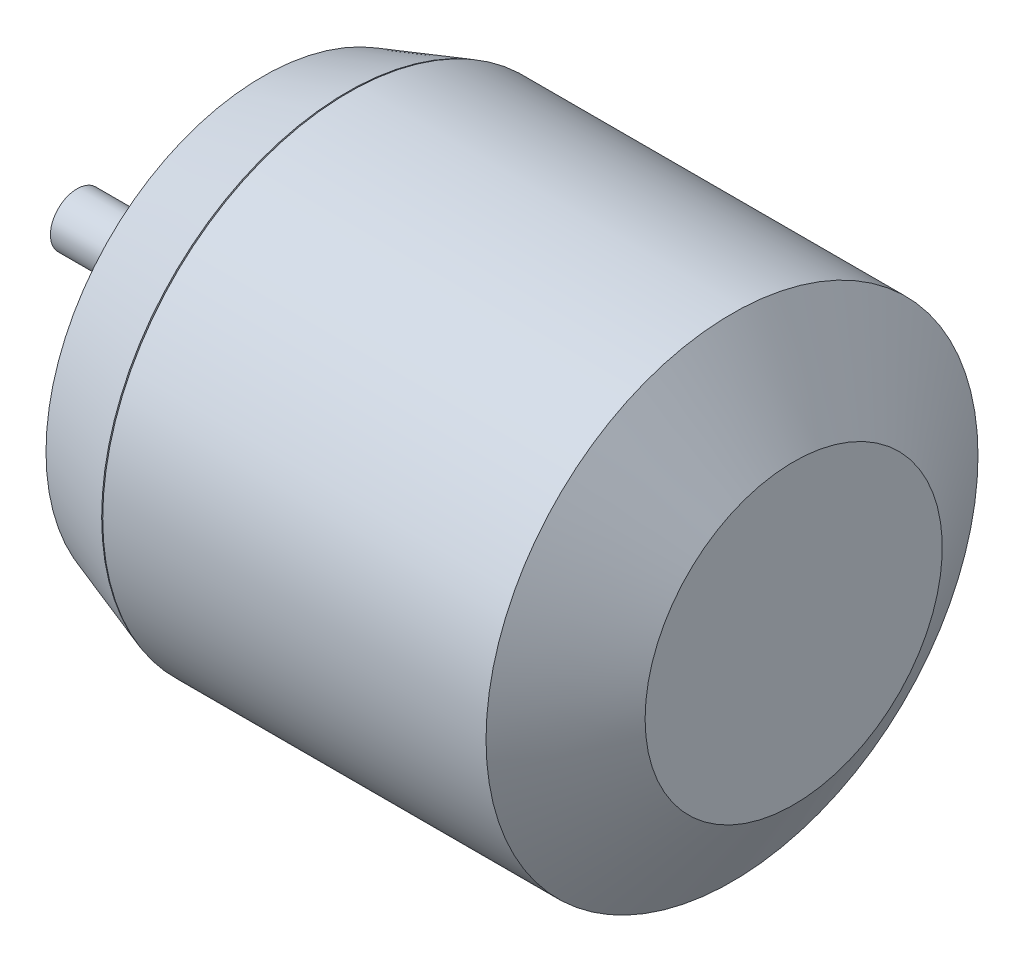
ISO-10303-21;
HEADER;
FILE_DESCRIPTION(('STEP AP214'),'2;1');
FILE_NAME('part.step','',(''),(''),'','','');
FILE_SCHEMA(('AUTOMOTIVE_DESIGN { 1 0 10303 214 1 1 1 1 }'));
ENDSEC;
DATA;
#1=APPLICATION_CONTEXT('core data for automotive mechanical design processes');
#2=APPLICATION_PROTOCOL_DEFINITION('international standard','automotive_design',2000,#1);
#3=PRODUCT_CONTEXT('',#1,'mechanical');
#4=PRODUCT('Part','Part','',(#3));
#5=PRODUCT_RELATED_PRODUCT_CATEGORY('part','',(#4));
#6=PRODUCT_DEFINITION_FORMATION('','',#4);
#7=PRODUCT_DEFINITION_CONTEXT('part definition',#1,'design');
#8=PRODUCT_DEFINITION('design','',#6,#7);
#9=PRODUCT_DEFINITION_SHAPE('','',#8);
#10=(LENGTH_UNIT() NAMED_UNIT(*) SI_UNIT(.MILLI.,.METRE.));
#11=(NAMED_UNIT(*) PLANE_ANGLE_UNIT() SI_UNIT($,.RADIAN.));
#12=(NAMED_UNIT(*) SI_UNIT($,.STERADIAN.) SOLID_ANGLE_UNIT());
#13=UNCERTAINTY_MEASURE_WITH_UNIT(LENGTH_MEASURE(1.E-05),#10,'distance_accuracy_value','');
#14=(GEOMETRIC_REPRESENTATION_CONTEXT(3) GLOBAL_UNCERTAINTY_ASSIGNED_CONTEXT((#13)) GLOBAL_UNIT_ASSIGNED_CONTEXT((#10,
#11,#12)) REPRESENTATION_CONTEXT('',''));
#15=CARTESIAN_POINT('',(0.,0.,0.));
#16=DIRECTION('',(0.,0.,1.));
#17=DIRECTION('',(1.,0.,0.));
#18=AXIS2_PLACEMENT_3D('',#15,#16,#17);
#19=CARTESIAN_POINT('',(-25.1452057720306,0.,0.));
#20=DIRECTION('',(1.,0.,0.));
#21=DIRECTION('',(0.,0.,-1.));
#22=AXIS2_PLACEMENT_3D('',#19,#20,#21);
#23=CONICAL_SURFACE('',#22,6.9,0.429327057848925);
#24=CARTESIAN_POINT('',(-25.1452057720306,0.,0.));
#25=DIRECTION('',(-1.,0.,0.));
#26=DIRECTION('',(0.,0.,1.));
#27=AXIS2_PLACEMENT_3D('',#24,#25,#26);
#28=CIRCLE('',#27,6.9);
#29=CARTESIAN_POINT('',(-25.1452057720306,-3.51905299043924,5.93517194784453));
#30=VERTEX_POINT('',#29);
#31=CARTESIAN_POINT('',(-25.1452057720306,4.99725638669145,-4.75788068426179));
#32=VERTEX_POINT('',#31);
#33=EDGE_CURVE('E97',#30,#32,#28,.T.);
#34=ORIENTED_EDGE('',*,*,#33,.T.);
#35=CARTESIAN_POINT('',(-25.145005772029,4.99738174548814,-4.75788180233565));
#36=CARTESIAN_POINT('',(-25.1603238235413,4.98778474300103,-4.75779287370484));
#37=CARTESIAN_POINT('',(-25.1755932331706,4.9781127907812,-4.75779975591919));
#38=CARTESIAN_POINT('',(-25.2060347689655,4.95861898668227,-4.75800514204022));
#39=CARTESIAN_POINT('',(-25.2212068951293,4.9487971348002,-4.75820364595073));
#40=CARTESIAN_POINT('',(-25.2363303794081,4.93890033318242,-4.75849796071019));
#41=B_SPLINE_CURVE_WITH_KNOTS('',3,(#35,#36,#37,#38,#39,#40),.UNSPECIFIED.,.F.,.F.,(4,2,4),(0.,
0.0542246641095933,0.108449329297418),.UNSPECIFIED.);
#42=CARTESIAN_POINT('',(-25.2361303794081,4.93903126070327,-4.75849403327332));
#43=VERTEX_POINT('',#42);
#44=EDGE_CURVE('E173',#32,#43,#41,.T.);
#45=ORIENTED_EDGE('',*,*,#44,.T.);
#46=CARTESIAN_POINT('',(-25.2361303794081,0.,0.));
#47=DIRECTION('',(-1.,0.,0.));
#48=DIRECTION('',(0.,0.,1.));
#49=AXIS2_PLACEMENT_3D('',#46,#47,#48);
#50=CIRCLE('',#49,6.85837409732817);
#51=CARTESIAN_POINT('',(-25.2361303794081,-3.53267926166389,5.87856040992281));
#52=VERTEX_POINT('',#51);
#53=EDGE_CURVE('E98',#52,#43,#50,.T.);
#54=ORIENTED_EDGE('',*,*,#53,.F.);
#55=CARTESIAN_POINT('',(-25.9610430816436,-3.86458885541579,5.25929741176484));
#56=CARTESIAN_POINT('',(-25.9477252974255,-3.84502247947316,5.28123920977013));
#57=CARTESIAN_POINT('',(-25.9325982722109,-3.82671214210631,5.3030539444413));
#58=CARTESIAN_POINT('',(-25.8995326379729,-3.79243431141013,5.34619155358342));
#59=CARTESIAN_POINT('',(-25.8816071462209,-3.77645652880026,5.36751621553208));
#60=CARTESIAN_POINT('',(-25.825158695959,-3.73194652846786,5.43010394495082));
#61=CARTESIAN_POINT('',(-25.7835468642932,-3.70630194832748,5.4706057619467));
#62=CARTESIAN_POINT('',(-25.7022958103188,-3.66450192424559,5.54329334026213));
#63=CARTESIAN_POINT('',(-25.6633429796953,-3.64749285801017,5.57579796245902));
#64=CARTESIAN_POINT('',(-25.5830335119541,-3.61689082679079,5.63942387452686));
#65=CARTESIAN_POINT('',(-25.5416759933171,-3.60329912440231,5.6705446496298));
#66=CARTESIAN_POINT('',(-25.4146016102886,-3.56654491373128,5.76245551290415));
#67=CARTESIAN_POINT('',(-25.3263354821256,-3.54761038193469,5.82141035858996));
#68=CARTESIAN_POINT('',(-25.2060807074198,-3.52770534208598,5.89759855881237));
#69=CARTESIAN_POINT('',(-25.1756346088298,-3.52315424686136,5.91654526061992));
#70=CARTESIAN_POINT('',(-25.1412778810979,-3.51852357710136,5.93757636714795));
#71=CARTESIAN_POINT('',(-25.1375472831263,-3.51802738878405,5.93985542908198));
#72=CARTESIAN_POINT('',(-25.1338140027945,-3.51753740525783,5.94213160117815));
#73=B_SPLINE_CURVE_WITH_KNOTS('',3,(#55,#56,#57,#58,#59,#60,#61,#62,#63,#64,#65,#66,#67,#68,#69,
#70,#71,#72),.UNSPECIFIED.,.F.,.F.,(4,2,2,2,2,2,2,2,4),(0.,0.0965983438161288,0.192756791854487,
0.382355240273739,0.542697768388109,0.703099450648593,1.02577192879648,1.13421840937265,
1.14741762598275),.UNSPECIFIED.);
#74=EDGE_CURVE('E52',#52,#30,#73,.T.);
#75=ORIENTED_EDGE('',*,*,#74,.T.);
#76=EDGE_LOOP('',(#34,#45,#54,#75));
#77=FACE_BOUND('',#76,.T.);
#78=ADVANCED_FACE('F37',(#77),#23,.T.);
#79=CARTESIAN_POINT('',(-40.5,0.,0.));
#80=DIRECTION('',(1.,0.,0.));
#81=DIRECTION('',(0.,0.,-1.));
#82=AXIS2_PLACEMENT_3D('',#79,#80,#81);
#83=PLANE('',#82);
#84=CARTESIAN_POINT('',(-40.5,0.,0.));
#85=DIRECTION('',(-1.,0.,0.));
#86=DIRECTION('',(0.,0.,1.));
#87=AXIS2_PLACEMENT_3D('',#84,#85,#86);
#88=CIRCLE('',#87,1.5);
#89=CARTESIAN_POINT('',(-40.5,0.,1.5));
#90=VERTEX_POINT('',#89);
#91=EDGE_CURVE('E272',#90,#90,#88,.T.);
#92=ORIENTED_EDGE('',*,*,#91,.T.);
#93=EDGE_LOOP('',(#92));
#94=FACE_BOUND('',#93,.T.);
#95=ADVANCED_FACE('F39',(#94),#83,.F.);
#96=CARTESIAN_POINT('',(0.,0.,0.));
#97=DIRECTION('',(1.,0.,0.));
#98=DIRECTION('',(0.,0.,-1.));
#99=AXIS2_PLACEMENT_3D('',#96,#97,#98);
#100=PLANE('',#99);
#101=CARTESIAN_POINT('',(0.,0.,0.));
#102=DIRECTION('',(-1.,0.,0.));
#103=DIRECTION('',(0.,0.,1.));
#104=AXIS2_PLACEMENT_3D('',#101,#102,#103);
#105=CIRCLE('',#104,8.3963945868005);
#106=CARTESIAN_POINT('',(0.,0.,8.3963945868005));
#107=VERTEX_POINT('',#106);
#108=EDGE_CURVE('E11',#107,#107,#105,.T.);
#109=ORIENTED_EDGE('',*,*,#108,.F.);
#110=EDGE_LOOP('',(#109));
#111=FACE_BOUND('',#110,.T.);
#112=ADVANCED_FACE('F116',(#111),#100,.T.);
#113=CARTESIAN_POINT('',(-3.48502507617356,0.,0.));
#114=DIRECTION('',(-1.,0.,0.));
#115=DIRECTION('',(0.,0.,1.));
#116=AXIS2_PLACEMENT_3D('',#113,#114,#115);
#117=CONICAL_SURFACE('',#116,13.9,1.00630366789389);
#118=ORIENTED_EDGE('',*,*,#108,.T.);
#119=EDGE_LOOP('',(#118));
#120=FACE_BOUND('',#119,.T.);
#121=CARTESIAN_POINT('',(-3.48502507617356,0.,0.));
#122=DIRECTION('',(-1.,0.,0.));
#123=DIRECTION('',(0.,0.,1.));
#124=AXIS2_PLACEMENT_3D('',#121,#122,#123);
#125=CIRCLE('',#124,13.9);
#126=CARTESIAN_POINT('',(-3.48502507617356,0.,13.9));
#127=VERTEX_POINT('',#126);
#128=EDGE_CURVE('E45',#127,#127,#125,.T.);
#129=ORIENTED_EDGE('',*,*,#128,.F.);
#130=EDGE_LOOP('',(#129));
#131=FACE_BOUND('',#130,.T.);
#132=ADVANCED_FACE('F114',(#120,#131),#117,.T.);
#133=CARTESIAN_POINT('',(-72.5044744062834,0.,0.));
#134=DIRECTION('',(-1.,0.,0.));
#135=DIRECTION('',(0.,0.,1.));
#136=AXIS2_PLACEMENT_3D('',#133,#134,#135);
#137=CYLINDRICAL_SURFACE('',#136,13.9);
#138=ORIENTED_EDGE('',*,*,#128,.T.);
#139=EDGE_LOOP('',(#138));
#140=FACE_BOUND('',#139,.T.);
#141=CARTESIAN_POINT('',(-25.1452057720306,0.,0.));
#142=DIRECTION('',(-1.,0.,0.));
#143=DIRECTION('',(0.,0.,1.));
#144=AXIS2_PLACEMENT_3D('',#141,#142,#143);
#145=CIRCLE('',#144,13.9);
#146=CARTESIAN_POINT('',(-25.1452057720306,0.,13.9));
#147=VERTEX_POINT('',#146);
#148=EDGE_CURVE('E106',#147,#147,#145,.T.);
#149=ORIENTED_EDGE('',*,*,#148,.F.);
#150=EDGE_LOOP('',(#149));
#151=FACE_BOUND('',#150,.T.);
#152=ADVANCED_FACE('F111',(#140,#151),#137,.T.);
#153=CARTESIAN_POINT('',(-25.1452057720306,0.,0.));
#154=DIRECTION('',(1.,0.,0.));
#155=DIRECTION('',(0.,0.,-1.));
#156=AXIS2_PLACEMENT_3D('',#153,#154,#155);
#157=PLANE('',#156);
#158=CARTESIAN_POINT('',(-25.1452057720306,-7.43116313131021,-5.91843007189033));
#159=DIRECTION('',(1.,0.,0.));
#160=DIRECTION('',(0.,0.,-1.));
#161=AXIS2_PLACEMENT_3D('',#158,#159,#160);
#162=CIRCLE('',#161,1.5);
#163=CARTESIAN_POINT('',(-25.1452057720306,-7.43116313131021,-7.41843007189033));
#164=VERTEX_POINT('',#163);
#165=EDGE_CURVE('E84',#164,#164,#162,.T.);
#166=ORIENTED_EDGE('',*,*,#165,.T.);
#167=EDGE_LOOP('',(#166));
#168=FACE_BOUND('',#167,.T.);
#169=CARTESIAN_POINT('',(-25.1452057720306,7.43116313131017,5.91843007189039));
#170=DIRECTION('',(1.,0.,0.));
#171=DIRECTION('',(0.,0.,-1.));
#172=AXIS2_PLACEMENT_3D('',#169,#170,#171);
#173=CIRCLE('',#172,1.5);
#174=CARTESIAN_POINT('',(-25.1452057720306,7.43116313131017,4.41843007189039));
#175=VERTEX_POINT('',#174);
#176=EDGE_CURVE('E152',#175,#175,#173,.T.);
#177=ORIENTED_EDGE('',*,*,#176,.T.);
#178=EDGE_LOOP('',(#177));
#179=FACE_BOUND('',#178,.T.);
#180=CARTESIAN_POINT('',(-25.1452057720306,3.5190529904392,-5.93517194784456));
#181=VERTEX_POINT('',#180);
#182=CARTESIAN_POINT('',(-25.1452057720306,-4.99725638669149,4.75788068426176));
#183=VERTEX_POINT('',#182);
#184=EDGE_CURVE('E92',#181,#183,#28,.T.);
#185=ORIENTED_EDGE('',*,*,#184,.F.);
#186=CARTESIAN_POINT('',(-25.1452057720306,4.98394111317083,-6.25782158426121));
#187=DIRECTION('',(1.,0.,0.));
#188=DIRECTION('',(0.,0.,-1.));
#189=AXIS2_PLACEMENT_3D('',#186,#187,#188);
#190=CIRCLE('',#189,1.5);
#191=EDGE_CURVE('E157',#181,#32,#190,.T.);
#192=ORIENTED_EDGE('',*,*,#191,.T.);
#193=ORIENTED_EDGE('',*,*,#33,.F.);
#194=CARTESIAN_POINT('',(-25.1452057720306,-4.98394111317088,6.25782158426118));
#195=DIRECTION('',(1.,0.,0.));
#196=DIRECTION('',(0.,0.,-1.));
#197=AXIS2_PLACEMENT_3D('',#194,#195,#196);
#198=CIRCLE('',#197,1.5);
#199=EDGE_CURVE('E93',#30,#183,#198,.T.);
#200=ORIENTED_EDGE('',*,*,#199,.T.);
#201=EDGE_LOOP('',(#185,#192,#193,#200));
#202=FACE_BOUND('',#201,.T.);
#203=ORIENTED_EDGE('',*,*,#148,.T.);
#204=EDGE_LOOP('',(#203));
#205=FACE_BOUND('',#204,.T.);
#206=ADVANCED_FACE('F123',(#168,#179,#202,#205),#157,.F.);
#207=CARTESIAN_POINT('',(-25.2361303794081,3.53267926166385,-5.87856040992283));
#208=VERTEX_POINT('',#207);
#209=CARTESIAN_POINT('',(-25.2361303794081,-4.9390312607033,4.75849403327329));
#210=VERTEX_POINT('',#209);
#211=EDGE_CURVE('E90',#208,#210,#50,.T.);
#212=ORIENTED_EDGE('',*,*,#211,.F.);
#213=CARTESIAN_POINT('',(-25.9610430816436,3.86458885541574,-5.25929741176488));
#214=CARTESIAN_POINT('',(-25.9477252974255,3.84502247947312,-5.28123920977017));
#215=CARTESIAN_POINT('',(-25.9325982722109,3.82671214210627,-5.30305394444133));
#216=CARTESIAN_POINT('',(-25.8995326379729,3.79243431141008,-5.34619155358345));
#217=CARTESIAN_POINT('',(-25.8816071462209,3.77645652880021,-5.36751621553212));
#218=CARTESIAN_POINT('',(-25.825158695959,3.73194652846782,-5.43010394495085));
#219=CARTESIAN_POINT('',(-25.7835468642932,3.70630194832743,-5.47060576194674));
#220=CARTESIAN_POINT('',(-25.7022958103188,3.66450192424555,-5.54329334026216));
#221=CARTESIAN_POINT('',(-25.6633429796953,3.64749285801012,-5.57579796245905));
#222=CARTESIAN_POINT('',(-25.5830335119541,3.61689082679075,-5.63942387452688));
#223=CARTESIAN_POINT('',(-25.5416759933171,3.60329912440227,-5.67054464962983));
#224=CARTESIAN_POINT('',(-25.4146016102886,3.56654491373124,-5.76245551290417));
#225=CARTESIAN_POINT('',(-25.3263354821256,3.54761038193465,-5.82141035858997));
#226=CARTESIAN_POINT('',(-25.2060807074203,3.52770534208602,-5.89759855881206));
#227=CARTESIAN_POINT('',(-25.1756346088309,3.52315424686147,-5.91654526061929));
#228=CARTESIAN_POINT('',(-25.141277881099,3.51852357710146,-5.93757636714734));
#229=CARTESIAN_POINT('',(-25.1375472831268,3.51802738878407,-5.93985542908169));
#230=CARTESIAN_POINT('',(-25.1338140027945,3.51753740525779,-5.94213160117818));
#231=B_SPLINE_CURVE_WITH_KNOTS('',3,(#213,#214,#215,#216,#217,#218,#219,#220,#221,#222,#223,
#224,#225,#226,#227,#228,#229,#230),.UNSPECIFIED.,.F.,.F.,(4,2,2,2,2,2,2,2,4),(0.,
0.0965983438161255,0.192756791854486,0.382355240273738,0.5426977683881,0.703099450648571,
1.02577192879644,1.1342184093708,1.14741762598275),.UNSPECIFIED.);
#232=EDGE_CURVE('E60',#208,#181,#231,.T.);
#233=ORIENTED_EDGE('',*,*,#232,.T.);
#234=ORIENTED_EDGE('',*,*,#184,.T.);
#235=CARTESIAN_POINT('',(-25.1450057720306,-4.9973817454872,4.7578818023356));
#236=CARTESIAN_POINT('',(-25.1603238235426,-4.98778474300025,4.7577928737048));
#237=CARTESIAN_POINT('',(-25.1755932331716,-4.97811279078057,4.75779975591915));
#238=CARTESIAN_POINT('',(-25.2060347689661,-4.95861898668197,4.7580051420402));
#239=CARTESIAN_POINT('',(-25.2212068951296,-4.94879713480005,4.7582036459507));
#240=CARTESIAN_POINT('',(-25.2363303794081,-4.93890033318244,4.75849796071016));
#241=B_SPLINE_CURVE_WITH_KNOTS('',3,(#235,#236,#237,#238,#239,#240),.UNSPECIFIED.,.F.,.F.,(4,2,
4),(0.,0.0542246641086849,0.108449329295604),.UNSPECIFIED.);
#242=EDGE_CURVE('E78',#183,#210,#241,.T.);
#243=ORIENTED_EDGE('',*,*,#242,.T.);
#244=EDGE_LOOP('',(#212,#233,#234,#243));
#245=FACE_BOUND('',#244,.T.);
#246=ADVANCED_FACE('F89',(#245),#23,.T.);
#247=CARTESIAN_POINT('',(-25.2361303794081,0.,0.));
#248=DIRECTION('',(-1.,0.,0.));
#249=DIRECTION('',(0.,0.,1.));
#250=AXIS2_PLACEMENT_3D('',#247,#248,#249);
#251=PLANE('',#250);
#252=CARTESIAN_POINT('',(-25.2361303794081,-7.43116313131021,-5.91843007189033));
#253=DIRECTION('',(-1.,0.,0.));
#254=DIRECTION('',(0.,0.,1.));
#255=AXIS2_PLACEMENT_3D('',#252,#253,#254);
#256=CIRCLE('',#255,1.5);
#257=CARTESIAN_POINT('',(-25.2361303794081,-7.43116313131021,-4.41843007189033));
#258=VERTEX_POINT('',#257);
#259=EDGE_CURVE('E205',#258,#258,#256,.T.);
#260=ORIENTED_EDGE('',*,*,#259,.T.);
#261=EDGE_LOOP('',(#260));
#262=FACE_BOUND('',#261,.T.);
#263=CARTESIAN_POINT('',(-25.2361303794081,7.43116313131017,5.91843007189039));
#264=DIRECTION('',(-1.,0.,0.));
#265=DIRECTION('',(0.,0.,1.));
#266=AXIS2_PLACEMENT_3D('',#263,#264,#265);
#267=CIRCLE('',#266,1.5);
#268=CARTESIAN_POINT('',(-25.2361303794081,7.43116313131017,7.41843007189039));
#269=VERTEX_POINT('',#268);
#270=EDGE_CURVE('E209',#269,#269,#267,.T.);
#271=ORIENTED_EDGE('',*,*,#270,.T.);
#272=EDGE_LOOP('',(#271));
#273=FACE_BOUND('',#272,.T.);
#274=CARTESIAN_POINT('',(-25.2361303794081,0.,0.));
#275=DIRECTION('',(-1.,0.,0.));
#276=DIRECTION('',(0.,0.,1.));
#277=AXIS2_PLACEMENT_3D('',#274,#275,#276);
#278=CIRCLE('',#277,13.869097433356);
#279=CARTESIAN_POINT('',(-25.2361303794081,0.,13.869097433356));
#280=VERTEX_POINT('',#279);
#281=EDGE_CURVE('E102',#280,#280,#278,.T.);
#282=ORIENTED_EDGE('',*,*,#281,.F.);
#283=EDGE_LOOP('',(#282));
#284=FACE_BOUND('',#283,.T.);
#285=ORIENTED_EDGE('',*,*,#53,.T.);
#286=CARTESIAN_POINT('',(-25.2361303794081,4.98394111317083,-6.25782158426121));
#287=DIRECTION('',(-1.,0.,0.));
#288=DIRECTION('',(0.,0.,1.));
#289=AXIS2_PLACEMENT_3D('',#286,#287,#288);
#290=CIRCLE('',#289,1.5);
#291=EDGE_CURVE('E96',#43,#208,#290,.T.);
#292=ORIENTED_EDGE('',*,*,#291,.T.);
#293=ORIENTED_EDGE('',*,*,#211,.T.);
#294=CARTESIAN_POINT('',(-25.2361303794081,-4.98394111317088,6.25782158426118));
#295=DIRECTION('',(-1.,0.,0.));
#296=DIRECTION('',(0.,0.,1.));
#297=AXIS2_PLACEMENT_3D('',#294,#295,#296);
#298=CIRCLE('',#297,1.5);
#299=EDGE_CURVE('E75',#210,#52,#298,.T.);
#300=ORIENTED_EDGE('',*,*,#299,.T.);
#301=EDGE_LOOP('',(#285,#292,#293,#300));
#302=FACE_BOUND('',#301,.T.);
#303=ADVANCED_FACE('F95',(#262,#273,#284,#302),#251,.F.);
#304=CARTESIAN_POINT('',(-30.,0.,0.));
#305=DIRECTION('',(1.,0.,0.));
#306=DIRECTION('',(0.,0.,-1.));
#307=AXIS2_PLACEMENT_3D('',#304,#305,#306);
#308=CONICAL_SURFACE('',#307,12.25,0.327622173426619);
#309=ORIENTED_EDGE('',*,*,#281,.T.);
#310=EDGE_LOOP('',(#309));
#311=FACE_BOUND('',#310,.T.);
#312=CARTESIAN_POINT('',(-30.,0.,0.));
#313=DIRECTION('',(-1.,0.,0.));
#314=DIRECTION('',(0.,0.,1.));
#315=AXIS2_PLACEMENT_3D('',#312,#313,#314);
#316=CIRCLE('',#315,12.25);
#317=CARTESIAN_POINT('',(-30.,0.,12.25));
#318=VERTEX_POINT('',#317);
#319=EDGE_CURVE('E266',#318,#318,#316,.T.);
#320=ORIENTED_EDGE('',*,*,#319,.F.);
#321=EDGE_LOOP('',(#320));
#322=FACE_BOUND('',#321,.T.);
#323=ADVANCED_FACE('F141',(#311,#322),#308,.T.);
#324=CARTESIAN_POINT('',(-30.,0.,0.));
#325=DIRECTION('',(1.,0.,0.));
#326=DIRECTION('',(0.,0.,-1.));
#327=AXIS2_PLACEMENT_3D('',#324,#325,#326);
#328=PLANE('',#327);
#329=CARTESIAN_POINT('',(-30.,4.98394111317083,-6.25782158426121));
#330=DIRECTION('',(-1.,0.,0.));
#331=DIRECTION('',(0.,0.,1.));
#332=AXIS2_PLACEMENT_3D('',#329,#330,#331);
#333=CIRCLE('',#332,1.5);
#334=CARTESIAN_POINT('',(-30.,4.98394111317083,-4.75782158426121));
#335=VERTEX_POINT('',#334);
#336=EDGE_CURVE('E226',#335,#335,#333,.T.);
#337=ORIENTED_EDGE('',*,*,#336,.F.);
#338=EDGE_LOOP('',(#337));
#339=FACE_BOUND('',#338,.T.);
#340=CARTESIAN_POINT('',(-30.,-4.98394111317088,6.25782158426118));
#341=DIRECTION('',(-1.,0.,0.));
#342=DIRECTION('',(0.,0.,-1.));
#343=AXIS2_PLACEMENT_3D('',#340,#341,#342);
#344=CIRCLE('',#343,1.5);
#345=CARTESIAN_POINT('',(-30.,-4.98394111317088,4.75782158426118));
#346=VERTEX_POINT('',#345);
#347=EDGE_CURVE('E219',#346,#346,#344,.T.);
#348=ORIENTED_EDGE('',*,*,#347,.F.);
#349=EDGE_LOOP('',(#348));
#350=FACE_BOUND('',#349,.T.);
#351=CARTESIAN_POINT('',(-30.,-7.43116313131021,-5.91843007189033));
#352=DIRECTION('',(-1.,0.,0.));
#353=DIRECTION('',(0.,0.,-1.));
#354=AXIS2_PLACEMENT_3D('',#351,#352,#353);
#355=CIRCLE('',#354,1.5);
#356=CARTESIAN_POINT('',(-30.,-7.43116313131021,-7.41843007189033));
#357=VERTEX_POINT('',#356);
#358=EDGE_CURVE('E231',#357,#357,#355,.T.);
#359=ORIENTED_EDGE('',*,*,#358,.F.);
#360=EDGE_LOOP('',(#359));
#361=FACE_BOUND('',#360,.T.);
#362=CARTESIAN_POINT('',(-30.,7.43116313131017,5.91843007189039));
#363=DIRECTION('',(-1.,0.,0.));
#364=DIRECTION('',(0.,0.,1.));
#365=AXIS2_PLACEMENT_3D('',#362,#363,#364);
#366=CIRCLE('',#365,1.5);
#367=CARTESIAN_POINT('',(-30.,7.43116313131017,7.41843007189039));
#368=VERTEX_POINT('',#367);
#369=EDGE_CURVE('E213',#368,#368,#366,.T.);
#370=ORIENTED_EDGE('',*,*,#369,.F.);
#371=EDGE_LOOP('',(#370));
#372=FACE_BOUND('',#371,.T.);
#373=CARTESIAN_POINT('',(-30.,0.,0.));
#374=DIRECTION('',(-1.,0.,0.));
#375=DIRECTION('',(0.,0.,1.));
#376=AXIS2_PLACEMENT_3D('',#373,#374,#375);
#377=CIRCLE('',#376,1.5);
#378=CARTESIAN_POINT('',(-30.,0.,1.5));
#379=VERTEX_POINT('',#378);
#380=EDGE_CURVE('E268',#379,#379,#377,.T.);
#381=ORIENTED_EDGE('',*,*,#380,.F.);
#382=EDGE_LOOP('',(#381));
#383=FACE_BOUND('',#382,.T.);
#384=ORIENTED_EDGE('',*,*,#319,.T.);
#385=EDGE_LOOP('',(#384));
#386=FACE_BOUND('',#385,.T.);
#387=ADVANCED_FACE('F281',(#339,#350,#361,#372,#383,#386),#328,.F.);
#388=CARTESIAN_POINT('',(-72.5044744062834,0.,0.));
#389=DIRECTION('',(-1.,0.,0.));
#390=DIRECTION('',(0.,0.,1.));
#391=AXIS2_PLACEMENT_3D('',#388,#389,#390);
#392=CYLINDRICAL_SURFACE('',#391,1.5);
#393=ORIENTED_EDGE('',*,*,#91,.F.);
#394=EDGE_LOOP('',(#393));
#395=FACE_BOUND('',#394,.T.);
#396=ORIENTED_EDGE('',*,*,#380,.T.);
#397=EDGE_LOOP('',(#396));
#398=FACE_BOUND('',#397,.T.);
#399=ADVANCED_FACE('F255',(#395,#398),#392,.T.);
#400=CARTESIAN_POINT('',(-20.,7.43116313131017,5.91843007189039));
#401=DIRECTION('',(-1.,0.,0.));
#402=DIRECTION('',(0.,0.,1.));
#403=AXIS2_PLACEMENT_3D('',#400,#401,#402);
#404=CYLINDRICAL_SURFACE('',#403,1.5);
#405=ORIENTED_EDGE('',*,*,#369,.T.);
#406=EDGE_LOOP('',(#405));
#407=FACE_BOUND('',#406,.T.);
#408=ORIENTED_EDGE('',*,*,#270,.F.);
#409=EDGE_LOOP('',(#408));
#410=FACE_BOUND('',#409,.T.);
#411=ADVANCED_FACE('F250',(#407,#410),#404,.F.);
#412=CARTESIAN_POINT('',(-20.,-7.43116313131021,-5.91843007189033));
#413=DIRECTION('',(-1.,0.,0.));
#414=DIRECTION('',(0.,0.,1.));
#415=AXIS2_PLACEMENT_3D('',#412,#413,#414);
#416=CYLINDRICAL_SURFACE('',#415,1.5);
#417=ORIENTED_EDGE('',*,*,#358,.T.);
#418=EDGE_LOOP('',(#417));
#419=FACE_BOUND('',#418,.T.);
#420=ORIENTED_EDGE('',*,*,#259,.F.);
#421=EDGE_LOOP('',(#420));
#422=FACE_BOUND('',#421,.T.);
#423=ADVANCED_FACE('F194',(#419,#422),#416,.F.);
#424=CARTESIAN_POINT('',(-20.,-4.98394111317088,6.25782158426118));
#425=DIRECTION('',(-1.,0.,0.));
#426=DIRECTION('',(0.,0.,1.));
#427=AXIS2_PLACEMENT_3D('',#424,#425,#426);
#428=CYLINDRICAL_SURFACE('',#427,1.5);
#429=CARTESIAN_POINT('',(-20.,-4.98394111317088,6.25782158426118));
#430=DIRECTION('',(-1.,0.,0.));
#431=DIRECTION('',(0.,0.,-1.));
#432=AXIS2_PLACEMENT_3D('',#429,#430,#431);
#433=CIRCLE('',#432,1.5);
#434=CARTESIAN_POINT('',(-20.,-4.98394111317088,4.75782158426118));
#435=VERTEX_POINT('',#434);
#436=EDGE_CURVE('E222',#435,#435,#433,.T.);
#437=ORIENTED_EDGE('',*,*,#436,.F.);
#438=EDGE_LOOP('',(#437));
#439=FACE_BOUND('',#438,.T.);
#440=ORIENTED_EDGE('',*,*,#347,.T.);
#441=EDGE_LOOP('',(#440));
#442=FACE_BOUND('',#441,.T.);
#443=ORIENTED_EDGE('',*,*,#74,.F.);
#444=ORIENTED_EDGE('',*,*,#299,.F.);
#445=ORIENTED_EDGE('',*,*,#242,.F.);
#446=ORIENTED_EDGE('',*,*,#199,.F.);
#447=EDGE_LOOP('',(#443,#444,#445,#446));
#448=FACE_BOUND('',#447,.T.);
#449=ADVANCED_FACE('F77',(#439,#442,#448),#428,.F.);
#450=CARTESIAN_POINT('',(-20.,-4.98394111317088,6.25782158426118));
#451=DIRECTION('',(1.,0.,0.));
#452=DIRECTION('',(0.,0.,-1.));
#453=AXIS2_PLACEMENT_3D('',#450,#451,#452);
#454=PLANE('',#453);
#455=ORIENTED_EDGE('',*,*,#436,.T.);
#456=EDGE_LOOP('',(#455));
#457=FACE_BOUND('',#456,.T.);
#458=ADVANCED_FACE('F185',(#457),#454,.F.);
#459=CARTESIAN_POINT('',(-20.,4.98394111317083,-6.25782158426121));
#460=DIRECTION('',(-1.,0.,0.));
#461=DIRECTION('',(0.,0.,1.));
#462=AXIS2_PLACEMENT_3D('',#459,#460,#461);
#463=CYLINDRICAL_SURFACE('',#462,1.5);
#464=CARTESIAN_POINT('',(-20.,4.98394111317083,-6.25782158426121));
#465=DIRECTION('',(-1.,0.,0.));
#466=DIRECTION('',(0.,0.,1.));
#467=AXIS2_PLACEMENT_3D('',#464,#465,#466);
#468=CIRCLE('',#467,1.5);
#469=CARTESIAN_POINT('',(-20.,4.98394111317083,-4.75782158426121));
#470=VERTEX_POINT('',#469);
#471=EDGE_CURVE('E216',#470,#470,#468,.T.);
#472=ORIENTED_EDGE('',*,*,#471,.F.);
#473=EDGE_LOOP('',(#472));
#474=FACE_BOUND('',#473,.T.);
#475=ORIENTED_EDGE('',*,*,#336,.T.);
#476=EDGE_LOOP('',(#475));
#477=FACE_BOUND('',#476,.T.);
#478=ORIENTED_EDGE('',*,*,#232,.F.);
#479=ORIENTED_EDGE('',*,*,#291,.F.);
#480=ORIENTED_EDGE('',*,*,#44,.F.);
#481=ORIENTED_EDGE('',*,*,#191,.F.);
#482=EDGE_LOOP('',(#478,#479,#480,#481));
#483=FACE_BOUND('',#482,.T.);
#484=ADVANCED_FACE('F179',(#474,#477,#483),#463,.F.);
#485=CARTESIAN_POINT('',(-20.,4.98394111317083,-6.25782158426121));
#486=DIRECTION('',(-1.,0.,0.));
#487=DIRECTION('',(0.,0.,1.));
#488=AXIS2_PLACEMENT_3D('',#485,#486,#487);
#489=PLANE('',#488);
#490=ORIENTED_EDGE('',*,*,#471,.T.);
#491=EDGE_LOOP('',(#490));
#492=FACE_BOUND('',#491,.T.);
#493=ADVANCED_FACE('F184',(#492),#489,.T.);
#494=CARTESIAN_POINT('',(-20.,7.43116313131017,5.91843007189039));
#495=DIRECTION('',(-1.,0.,0.));
#496=DIRECTION('',(0.,0.,1.));
#497=AXIS2_PLACEMENT_3D('',#494,#495,#496);
#498=CIRCLE('',#497,1.5);
#499=CARTESIAN_POINT('',(-20.,7.43116313131017,7.41843007189039));
#500=VERTEX_POINT('',#499);
#501=EDGE_CURVE('E212',#500,#500,#498,.T.);
#502=ORIENTED_EDGE('',*,*,#501,.F.);
#503=EDGE_LOOP('',(#502));
#504=FACE_BOUND('',#503,.T.);
#505=ORIENTED_EDGE('',*,*,#176,.F.);
#506=EDGE_LOOP('',(#505));
#507=FACE_BOUND('',#506,.T.);
#508=ADVANCED_FACE('F247',(#504,#507),#404,.F.);
#509=CARTESIAN_POINT('',(-20.,7.43116313131017,5.91843007189039));
#510=DIRECTION('',(-1.,0.,0.));
#511=DIRECTION('',(0.,0.,1.));
#512=AXIS2_PLACEMENT_3D('',#509,#510,#511);
#513=PLANE('',#512);
#514=ORIENTED_EDGE('',*,*,#501,.T.);
#515=EDGE_LOOP('',(#514));
#516=FACE_BOUND('',#515,.T.);
#517=ADVANCED_FACE('F196',(#516),#513,.T.);
#518=CARTESIAN_POINT('',(-20.,-7.43116313131021,-5.91843007189033));
#519=DIRECTION('',(-1.,0.,0.));
#520=DIRECTION('',(0.,0.,-1.));
#521=AXIS2_PLACEMENT_3D('',#518,#519,#520);
#522=CIRCLE('',#521,1.5);
#523=CARTESIAN_POINT('',(-20.,-7.43116313131021,-7.41843007189033));
#524=VERTEX_POINT('',#523);
#525=EDGE_CURVE('E223',#524,#524,#522,.T.);
#526=ORIENTED_EDGE('',*,*,#525,.F.);
#527=EDGE_LOOP('',(#526));
#528=FACE_BOUND('',#527,.T.);
#529=ORIENTED_EDGE('',*,*,#165,.F.);
#530=EDGE_LOOP('',(#529));
#531=FACE_BOUND('',#530,.T.);
#532=ADVANCED_FACE('F239',(#528,#531),#416,.F.);
#533=CARTESIAN_POINT('',(-20.,-7.43116313131021,-5.91843007189033));
#534=DIRECTION('',(1.,0.,0.));
#535=DIRECTION('',(0.,0.,-1.));
#536=AXIS2_PLACEMENT_3D('',#533,#534,#535);
#537=PLANE('',#536);
#538=ORIENTED_EDGE('',*,*,#525,.T.);
#539=EDGE_LOOP('',(#538));
#540=FACE_BOUND('',#539,.T.);
#541=ADVANCED_FACE('F237',(#540),#537,.F.);
#542=CLOSED_SHELL('',(#78,#95,#112,#132,#152,#206,#246,#303,#323,#387,#399,#411,#423,#449,#458,
#484,#493,#508,#517,#532,#541));
#543=MANIFOLD_SOLID_BREP('B2',#542);
#544=ADVANCED_BREP_SHAPE_REPRESENTATION('',(#18,#543),#14);
#545=SHAPE_DEFINITION_REPRESENTATION(#9,#544);
ENDSEC;
END-ISO-10303-21;
